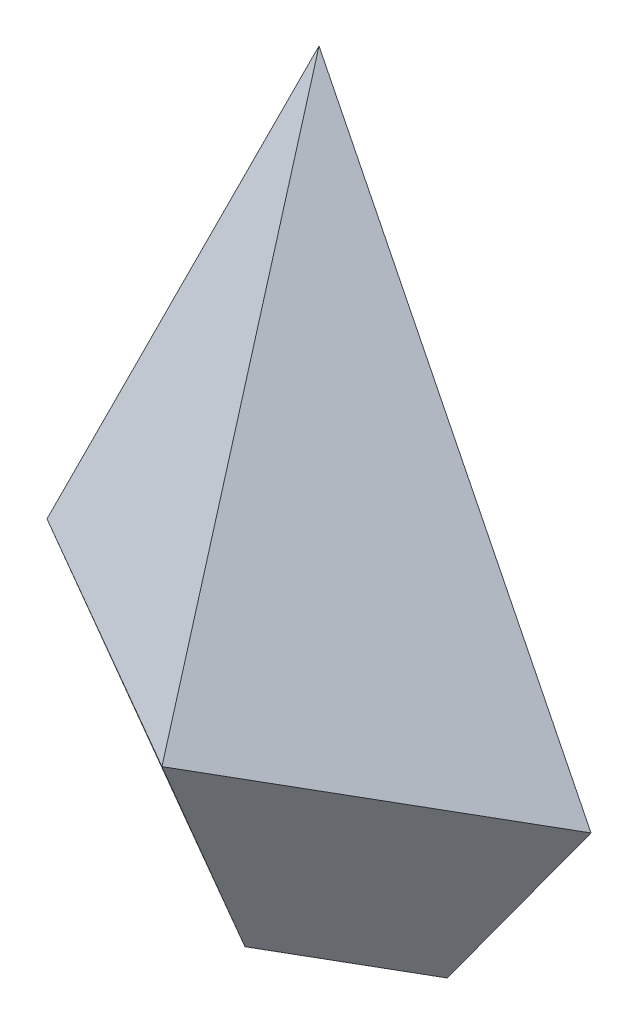
ISO-10303-21;
HEADER;
FILE_DESCRIPTION(('STEP AP214'),'2;1');
FILE_NAME('part.step','',(''),(''),'','','');
FILE_SCHEMA(('AUTOMOTIVE_DESIGN { 1 0 10303 214 1 1 1 1 }'));
ENDSEC;
DATA;
#1=APPLICATION_CONTEXT('core data for automotive mechanical design processes');
#2=APPLICATION_PROTOCOL_DEFINITION('international standard','automotive_design',2000,#1);
#3=PRODUCT_CONTEXT('',#1,'mechanical');
#4=PRODUCT('Part','Part','',(#3));
#5=PRODUCT_RELATED_PRODUCT_CATEGORY('part','',(#4));
#6=PRODUCT_DEFINITION_FORMATION('','',#4);
#7=PRODUCT_DEFINITION_CONTEXT('part definition',#1,'design');
#8=PRODUCT_DEFINITION('design','',#6,#7);
#9=PRODUCT_DEFINITION_SHAPE('','',#8);
#10=(LENGTH_UNIT() NAMED_UNIT(*) SI_UNIT(.MILLI.,.METRE.));
#11=(NAMED_UNIT(*) PLANE_ANGLE_UNIT() SI_UNIT($,.RADIAN.));
#12=(NAMED_UNIT(*) SI_UNIT($,.STERADIAN.) SOLID_ANGLE_UNIT());
#13=UNCERTAINTY_MEASURE_WITH_UNIT(LENGTH_MEASURE(1.E-05),#10,'distance_accuracy_value','');
#14=(GEOMETRIC_REPRESENTATION_CONTEXT(3) GLOBAL_UNCERTAINTY_ASSIGNED_CONTEXT((#13)) GLOBAL_UNIT_ASSIGNED_CONTEXT((#10,
#11,#12)) REPRESENTATION_CONTEXT('',''));
#15=CARTESIAN_POINT('',(0.,0.,0.));
#16=DIRECTION('',(0.,0.,1.));
#17=DIRECTION('',(1.,0.,0.));
#18=AXIS2_PLACEMENT_3D('',#15,#16,#17);
#19=CARTESIAN_POINT('',(0.,0.,15.));
#20=DIRECTION('',(0.469846310392955,-0.342020143325669,0.813797681349373));
#21=DIRECTION('',(0.866025403784438,0.,-0.500000000000001));
#22=AXIS2_PLACEMENT_3D('',#19,#20,#21);
#23=PLANE('',#22);
#24=DIRECTION('',(0.866025403784438,0.,-0.500000000000001));
#25=VECTOR('',#24,1.);
#26=CARTESIAN_POINT('',(0.,0.,15.));
#27=LINE('',#26,#25);
#28=CARTESIAN_POINT('',(0.,0.,15.));
#29=VERTEX_POINT('',#28);
#30=CARTESIAN_POINT('',(25.9807621135331,0.,0.));
#31=VERTEX_POINT('',#30);
#32=EDGE_CURVE('E138',#29,#31,#27,.T.);
#33=ORIENTED_EDGE('',*,*,#32,.T.);
#34=DIRECTION('',(-0.588524735920105,-0.808479211365494,0.));
#35=VECTOR('',#34,1.);
#36=CARTESIAN_POINT('',(16.9820298896099,-12.3619067944739,0.));
#37=LINE('',#36,#35);
#38=CARTESIAN_POINT('',(55.0983808548293,40.,0.));
#39=VERTEX_POINT('',#38);
#40=EDGE_CURVE('E11',#39,#31,#37,.T.);
#41=ORIENTED_EDGE('',*,*,#40,.F.);
#42=DIRECTION('',(-0.866025403784438,0.,0.500000000000001));
#43=VECTOR('',#42,1.);
#44=CARTESIAN_POINT('',(13.7745952137074,40.,23.8582987638362));
#45=LINE('',#44,#43);
#46=CARTESIAN_POINT('',(0.,40.,31.8110650184483));
#47=VERTEX_POINT('',#46);
#48=EDGE_CURVE('E86',#47,#39,#45,.F.);
#49=ORIENTED_EDGE('',*,*,#48,.F.);
#50=DIRECTION('',(0.,-0.921891033043757,-0.387449252410576));
#51=VECTOR('',#50,1.);
#52=CARTESIAN_POINT('',(0.,0.,15.));
#53=LINE('',#52,#51);
#54=EDGE_CURVE('E89',#47,#29,#53,.T.);
#55=ORIENTED_EDGE('',*,*,#54,.T.);
#56=EDGE_LOOP('',(#33,#41,#49,#55));
#57=FACE_BOUND('',#56,.T.);
#58=ADVANCED_FACE('F39',(#57),#23,.T.);
#59=CARTESIAN_POINT('',(0.,0.,-15.));
#60=DIRECTION('',(0.469846310392955,-0.342020143325669,-0.813797681349373));
#61=DIRECTION('',(-0.866025403784438,0.,-0.500000000000001));
#62=AXIS2_PLACEMENT_3D('',#59,#60,#61);
#63=PLANE('',#62);
#64=DIRECTION('',(-0.866025403784438,0.,-0.500000000000001));
#65=VECTOR('',#64,1.);
#66=CARTESIAN_POINT('',(0.,0.,-15.));
#67=LINE('',#66,#65);
#68=CARTESIAN_POINT('',(0.,0.,-15.));
#69=VERTEX_POINT('',#68);
#70=EDGE_CURVE('E135',#31,#69,#67,.T.);
#71=ORIENTED_EDGE('',*,*,#70,.T.);
#72=DIRECTION('',(0.,-0.921891033043757,0.387449252410576));
#73=VECTOR('',#72,1.);
#74=CARTESIAN_POINT('',(0.,-5.35778987335227,-12.7482461520973));
#75=LINE('',#74,#73);
#76=CARTESIAN_POINT('',(0.,40.,-31.8110650184483));
#77=VERTEX_POINT('',#76);
#78=EDGE_CURVE('E49',#77,#69,#75,.T.);
#79=ORIENTED_EDGE('',*,*,#78,.F.);
#80=DIRECTION('',(0.866025403784438,0.,0.500000000000001));
#81=VECTOR('',#80,1.);
#82=CARTESIAN_POINT('',(13.7745952137074,40.,-23.8582987638362));
#83=LINE('',#82,#81);
#84=EDGE_CURVE('E96',#39,#77,#83,.F.);
#85=ORIENTED_EDGE('',*,*,#84,.F.);
#86=ORIENTED_EDGE('',*,*,#40,.T.);
#87=EDGE_LOOP('',(#71,#79,#85,#86));
#88=FACE_BOUND('',#87,.T.);
#89=ADVANCED_FACE('F41',(#88),#63,.T.);
#90=CARTESIAN_POINT('',(-25.9807621135331,0.,0.));
#91=DIRECTION('',(-0.469846310392955,-0.342020143325669,-0.813797681349373));
#92=DIRECTION('',(-0.866025403784438,0.,0.500000000000001));
#93=AXIS2_PLACEMENT_3D('',#90,#91,#92);
#94=PLANE('',#93);
#95=DIRECTION('',(-0.866025403784438,0.,0.500000000000001));
#96=VECTOR('',#95,1.);
#97=CARTESIAN_POINT('',(-25.9807621135331,0.,0.));
#98=LINE('',#97,#96);
#99=CARTESIAN_POINT('',(-25.9807621135331,0.,0.));
#100=VERTEX_POINT('',#99);
#101=EDGE_CURVE('E132',#69,#100,#98,.T.);
#102=ORIENTED_EDGE('',*,*,#101,.T.);
#103=DIRECTION('',(0.588524735920105,-0.808479211365493,0.));
#104=VECTOR('',#103,1.);
#105=CARTESIAN_POINT('',(-25.9807621135331,0.,0.));
#106=LINE('',#105,#104);
#107=CARTESIAN_POINT('',(-55.0983808548293,40.,0.));
#108=VERTEX_POINT('',#107);
#109=EDGE_CURVE('E57',#108,#100,#106,.T.);
#110=ORIENTED_EDGE('',*,*,#109,.F.);
#111=DIRECTION('',(0.866025403784438,0.,-0.500000000000001));
#112=VECTOR('',#111,1.);
#113=CARTESIAN_POINT('',(-13.7745952137074,40.,-23.8582987638362));
#114=LINE('',#113,#112);
#115=EDGE_CURVE('E118',#77,#108,#114,.F.);
#116=ORIENTED_EDGE('',*,*,#115,.F.);
#117=ORIENTED_EDGE('',*,*,#78,.T.);
#118=EDGE_LOOP('',(#102,#110,#116,#117));
#119=FACE_BOUND('',#118,.T.);
#120=ADVANCED_FACE('F185',(#119),#94,.T.);
#121=CARTESIAN_POINT('',(-25.9807621135331,0.,0.));
#122=DIRECTION('',(-0.469846310392955,-0.342020143325669,0.813797681349373));
#123=DIRECTION('',(0.866025403784438,0.,0.500000000000001));
#124=AXIS2_PLACEMENT_3D('',#121,#122,#123);
#125=PLANE('',#124);
#126=DIRECTION('',(0.866025403784438,0.,0.500000000000001));
#127=VECTOR('',#126,1.);
#128=CARTESIAN_POINT('',(-25.9807621135331,0.,0.));
#129=LINE('',#128,#127);
#130=EDGE_CURVE('E97',#100,#29,#129,.T.);
#131=ORIENTED_EDGE('',*,*,#130,.T.);
#132=ORIENTED_EDGE('',*,*,#54,.F.);
#133=DIRECTION('',(-0.866025403784438,0.,-0.500000000000001));
#134=VECTOR('',#133,1.);
#135=CARTESIAN_POINT('',(-13.7745952137074,40.,23.8582987638362));
#136=LINE('',#135,#134);
#137=EDGE_CURVE('E43',#108,#47,#136,.F.);
#138=ORIENTED_EDGE('',*,*,#137,.F.);
#139=ORIENTED_EDGE('',*,*,#109,.T.);
#140=EDGE_LOOP('',(#131,#132,#138,#139));
#141=FACE_BOUND('',#140,.T.);
#142=ADVANCED_FACE('F100',(#141),#125,.T.);
#143=CARTESIAN_POINT('',(0.,0.,0.));
#144=DIRECTION('',(0.,-1.,0.));
#145=DIRECTION('',(0.,0.,-1.));
#146=AXIS2_PLACEMENT_3D('',#143,#144,#145);
#147=PLANE('',#146);
#148=CARTESIAN_POINT('',(0.,0.,0.));
#149=DIRECTION('',(0.,-1.,0.));
#150=DIRECTION('',(0.,0.,-1.));
#151=AXIS2_PLACEMENT_3D('',#148,#149,#150);
#152=CIRCLE('',#151,10.005);
#153=CARTESIAN_POINT('',(0.,0.,-10.005));
#154=VERTEX_POINT('',#153);
#155=EDGE_CURVE('E149',#154,#154,#152,.T.);
#156=ORIENTED_EDGE('',*,*,#155,.F.);
#157=EDGE_LOOP('',(#156));
#158=FACE_BOUND('',#157,.T.);
#159=ORIENTED_EDGE('',*,*,#32,.F.);
#160=ORIENTED_EDGE('',*,*,#130,.F.);
#161=ORIENTED_EDGE('',*,*,#101,.F.);
#162=ORIENTED_EDGE('',*,*,#70,.F.);
#163=EDGE_LOOP('',(#159,#160,#161,#162));
#164=FACE_BOUND('',#163,.T.);
#165=ADVANCED_FACE('F166',(#158,#164),#147,.T.);
#166=CARTESIAN_POINT('',(0.,40.,-31.8110650184483));
#167=DIRECTION('',(-0.485147863137999,0.241921895599668,-0.840300748138484));
#168=DIRECTION('',(-0.866025403784438,0.,0.500000000000001));
#169=AXIS2_PLACEMENT_3D('',#166,#167,#168);
#170=PLANE('',#169);
#171=ORIENTED_EDGE('',*,*,#115,.T.);
#172=DIRECTION('',(-0.446251135955037,-0.894907773828588,0.));
#173=VECTOR('',#172,1.);
#174=CARTESIAN_POINT('',(-55.0983808548293,40.,0.));
#175=LINE('',#174,#173);
#176=CARTESIAN_POINT('',(0.,150.493767700623,0.));
#177=VERTEX_POINT('',#176);
#178=EDGE_CURVE('E112',#177,#108,#175,.T.);
#179=ORIENTED_EDGE('',*,*,#178,.F.);
#180=DIRECTION('',(0.,-0.960967373917284,-0.276661718108088));
#181=VECTOR('',#180,1.);
#182=CARTESIAN_POINT('',(0.,40.,-31.8110650184483));
#183=LINE('',#182,#181);
#184=EDGE_CURVE('E143',#177,#77,#183,.T.);
#185=ORIENTED_EDGE('',*,*,#184,.T.);
#186=EDGE_LOOP('',(#171,#179,#185));
#187=FACE_BOUND('',#186,.T.);
#188=ADVANCED_FACE('F169',(#187),#170,.T.);
#189=CARTESIAN_POINT('',(-55.0983808548293,40.,0.));
#190=DIRECTION('',(-0.485147863137999,0.241921895599668,0.840300748138484));
#191=DIRECTION('',(0.866025403784438,0.,0.500000000000001));
#192=AXIS2_PLACEMENT_3D('',#189,#190,#191);
#193=PLANE('',#192);
#194=ORIENTED_EDGE('',*,*,#137,.T.);
#195=DIRECTION('',(0.,-0.960967373917284,0.276661718108088));
#196=VECTOR('',#195,1.);
#197=CARTESIAN_POINT('',(0.,40.,31.8110650184483));
#198=LINE('',#197,#196);
#199=EDGE_CURVE('E106',#177,#47,#198,.T.);
#200=ORIENTED_EDGE('',*,*,#199,.F.);
#201=ORIENTED_EDGE('',*,*,#178,.T.);
#202=EDGE_LOOP('',(#194,#200,#201));
#203=FACE_BOUND('',#202,.T.);
#204=ADVANCED_FACE('F114',(#203),#193,.T.);
#205=CARTESIAN_POINT('',(0.,40.,31.8110650184483));
#206=DIRECTION('',(0.485147863137999,0.241921895599668,0.840300748138484));
#207=DIRECTION('',(0.866025403784438,0.,-0.500000000000001));
#208=AXIS2_PLACEMENT_3D('',#205,#206,#207);
#209=PLANE('',#208);
#210=ORIENTED_EDGE('',*,*,#48,.T.);
#211=DIRECTION('',(0.446251135955037,-0.894907773828588,0.));
#212=VECTOR('',#211,1.);
#213=CARTESIAN_POINT('',(55.0983808548293,40.,0.));
#214=LINE('',#213,#212);
#215=EDGE_CURVE('E108',#177,#39,#214,.T.);
#216=ORIENTED_EDGE('',*,*,#215,.F.);
#217=ORIENTED_EDGE('',*,*,#199,.T.);
#218=EDGE_LOOP('',(#210,#216,#217));
#219=FACE_BOUND('',#218,.T.);
#220=ADVANCED_FACE('F107',(#219),#209,.T.);
#221=CARTESIAN_POINT('',(55.0983808548293,40.,0.));
#222=DIRECTION('',(0.485147863137999,0.241921895599668,-0.840300748138484));
#223=DIRECTION('',(-0.866025403784438,0.,-0.500000000000001));
#224=AXIS2_PLACEMENT_3D('',#221,#222,#223);
#225=PLANE('',#224);
#226=ORIENTED_EDGE('',*,*,#84,.T.);
#227=ORIENTED_EDGE('',*,*,#184,.F.);
#228=ORIENTED_EDGE('',*,*,#215,.T.);
#229=EDGE_LOOP('',(#226,#227,#228));
#230=FACE_BOUND('',#229,.T.);
#231=ADVANCED_FACE('F162',(#230),#225,.T.);
#232=CARTESIAN_POINT('',(0.,50.,0.));
#233=DIRECTION('',(0.,-1.,0.));
#234=DIRECTION('',(0.,0.,-1.));
#235=AXIS2_PLACEMENT_3D('',#232,#233,#234);
#236=CYLINDRICAL_SURFACE('',#235,10.005);
#237=CARTESIAN_POINT('',(0.,50.,0.));
#238=DIRECTION('',(0.,-1.,0.));
#239=DIRECTION('',(0.,0.,-1.));
#240=AXIS2_PLACEMENT_3D('',#237,#238,#239);
#241=CIRCLE('',#240,10.005);
#242=CARTESIAN_POINT('',(0.,50.,-10.005));
#243=VERTEX_POINT('',#242);
#244=EDGE_CURVE('E146',#243,#243,#241,.T.);
#245=ORIENTED_EDGE('',*,*,#244,.F.);
#246=EDGE_LOOP('',(#245));
#247=FACE_BOUND('',#246,.T.);
#248=ORIENTED_EDGE('',*,*,#155,.T.);
#249=EDGE_LOOP('',(#248));
#250=FACE_BOUND('',#249,.T.);
#251=ADVANCED_FACE('F159',(#247,#250),#236,.F.);
#252=CARTESIAN_POINT('',(0.,50.,0.));
#253=DIRECTION('',(0.,-1.,0.));
#254=DIRECTION('',(0.,0.,-1.));
#255=AXIS2_PLACEMENT_3D('',#252,#253,#254);
#256=PLANE('',#255);
#257=ORIENTED_EDGE('',*,*,#244,.T.);
#258=EDGE_LOOP('',(#257));
#259=FACE_BOUND('',#258,.T.);
#260=ADVANCED_FACE('F157',(#259),#256,.T.);
#261=CLOSED_SHELL('',(#58,#89,#120,#142,#165,#188,#204,#220,#231,#251,#260));
#262=MANIFOLD_SOLID_BREP('B2',#261);
#263=ADVANCED_BREP_SHAPE_REPRESENTATION('',(#18,#262),#14);
#264=SHAPE_DEFINITION_REPRESENTATION(#9,#263);
ENDSEC;
END-ISO-10303-21;
